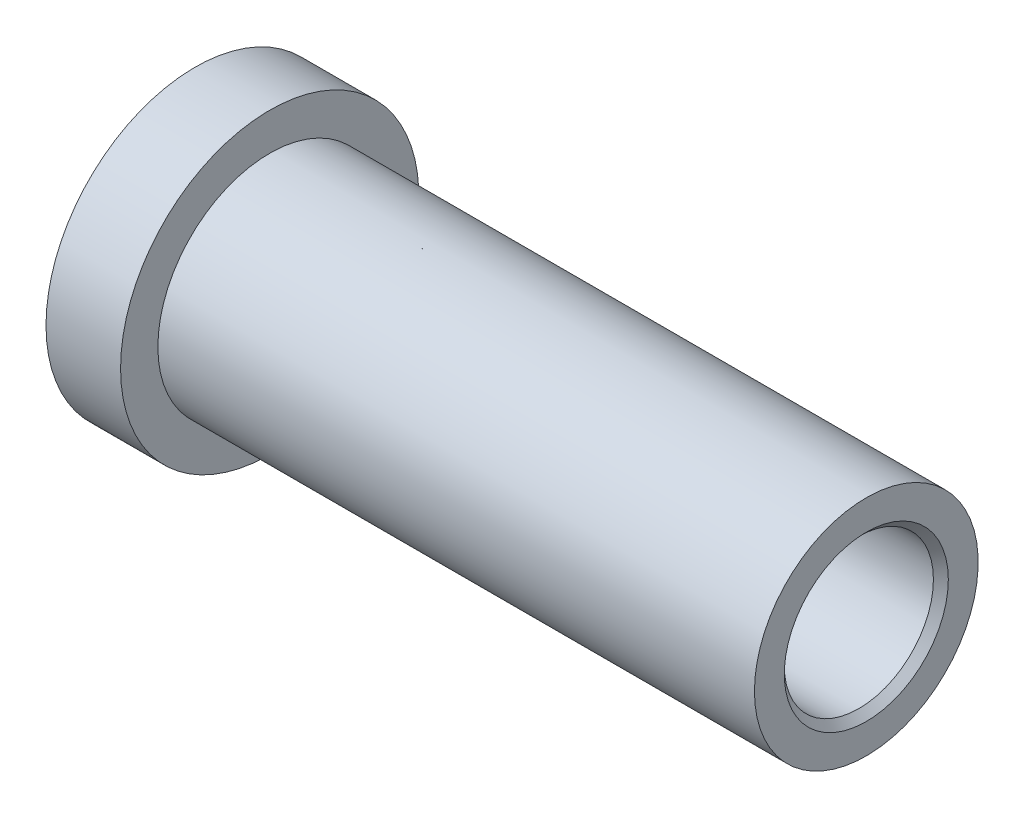
ISO-10303-21;
HEADER;
FILE_DESCRIPTION(('STEP AP214'),'2;1');
FILE_NAME('part.step','',(''),(''),'','','');
FILE_SCHEMA(('AUTOMOTIVE_DESIGN { 1 0 10303 214 1 1 1 1 }'));
ENDSEC;
DATA;
#1=APPLICATION_CONTEXT('core data for automotive mechanical design processes');
#2=APPLICATION_PROTOCOL_DEFINITION('international standard','automotive_design',2000,#1);
#3=PRODUCT_CONTEXT('',#1,'mechanical');
#4=PRODUCT('Part','Part','',(#3));
#5=PRODUCT_RELATED_PRODUCT_CATEGORY('part','',(#4));
#6=PRODUCT_DEFINITION_FORMATION('','',#4);
#7=PRODUCT_DEFINITION_CONTEXT('part definition',#1,'design');
#8=PRODUCT_DEFINITION('design','',#6,#7);
#9=PRODUCT_DEFINITION_SHAPE('','',#8);
#10=(LENGTH_UNIT() NAMED_UNIT(*) SI_UNIT(.MILLI.,.METRE.));
#11=(NAMED_UNIT(*) PLANE_ANGLE_UNIT() SI_UNIT($,.RADIAN.));
#12=(NAMED_UNIT(*) SI_UNIT($,.STERADIAN.) SOLID_ANGLE_UNIT());
#13=UNCERTAINTY_MEASURE_WITH_UNIT(LENGTH_MEASURE(1.E-05),#10,'distance_accuracy_value','');
#14=(GEOMETRIC_REPRESENTATION_CONTEXT(3) GLOBAL_UNCERTAINTY_ASSIGNED_CONTEXT((#13)) GLOBAL_UNIT_ASSIGNED_CONTEXT((#10,
#11,#12)) REPRESENTATION_CONTEXT('',''));
#15=CARTESIAN_POINT('',(0.,0.,0.));
#16=DIRECTION('',(0.,0.,1.));
#17=DIRECTION('',(1.,0.,0.));
#18=AXIS2_PLACEMENT_3D('',#15,#16,#17);
#19=CARTESIAN_POINT('',(0.,0.,0.));
#20=DIRECTION('',(-1.,0.,0.));
#21=DIRECTION('',(0.,0.,1.));
#22=AXIS2_PLACEMENT_3D('',#19,#20,#21);
#23=PLANE('',#22);
#24=CARTESIAN_POINT('',(0.,0.,0.));
#25=DIRECTION('',(-1.,0.,0.));
#26=DIRECTION('',(0.,0.,1.));
#27=AXIS2_PLACEMENT_3D('',#24,#25,#26);
#28=CIRCLE('',#27,5.50000000000001);
#29=CARTESIAN_POINT('',(0.,0.,5.50000000000001));
#30=VERTEX_POINT('',#29);
#31=EDGE_CURVE('E10',#30,#30,#28,.F.);
#32=ORIENTED_EDGE('',*,*,#31,.T.);
#33=EDGE_LOOP('',(#32));
#34=FACE_BOUND('',#33,.T.);
#35=CARTESIAN_POINT('',(0.,0.,0.));
#36=DIRECTION('',(-1.,0.,0.));
#37=DIRECTION('',(0.,0.,1.));
#38=AXIS2_PLACEMENT_3D('',#35,#36,#37);
#39=CIRCLE('',#38,10.);
#40=CARTESIAN_POINT('',(0.,0.,10.));
#41=VERTEX_POINT('',#40);
#42=EDGE_CURVE('E69',#41,#41,#39,.T.);
#43=ORIENTED_EDGE('',*,*,#42,.T.);
#44=EDGE_LOOP('',(#43));
#45=FACE_BOUND('',#44,.T.);
#46=ADVANCED_FACE('F39',(#34,#45),#23,.T.);
#47=CARTESIAN_POINT('',(0.,0.,0.));
#48=DIRECTION('',(-1.,0.,0.));
#49=DIRECTION('',(0.,0.,1.));
#50=AXIS2_PLACEMENT_3D('',#47,#48,#49);
#51=CYLINDRICAL_SURFACE('',#50,5.);
#52=CARTESIAN_POINT('',(44.5,0.,0.));
#53=DIRECTION('',(1.,0.,0.));
#54=DIRECTION('',(0.,0.,-1.));
#55=AXIS2_PLACEMENT_3D('',#52,#53,#54);
#56=CIRCLE('',#55,5.);
#57=CARTESIAN_POINT('',(44.5,0.,-5.));
#58=VERTEX_POINT('',#57);
#59=EDGE_CURVE('E47',#58,#58,#56,.T.);
#60=ORIENTED_EDGE('',*,*,#59,.T.);
#61=EDGE_LOOP('',(#60));
#62=FACE_BOUND('',#61,.T.);
#63=CARTESIAN_POINT('',(0.500000000000006,0.,0.));
#64=DIRECTION('',(-1.,0.,0.));
#65=DIRECTION('',(0.,0.,1.));
#66=AXIS2_PLACEMENT_3D('',#63,#64,#65);
#67=CIRCLE('',#66,5.);
#68=CARTESIAN_POINT('',(0.500000000000006,0.,5.));
#69=VERTEX_POINT('',#68);
#70=EDGE_CURVE('E51',#69,#69,#67,.T.);
#71=ORIENTED_EDGE('',*,*,#70,.T.);
#72=EDGE_LOOP('',(#71));
#73=FACE_BOUND('',#72,.T.);
#74=ADVANCED_FACE('F89',(#62,#73),#51,.F.);
#75=CARTESIAN_POINT('',(45.,0.,0.));
#76=DIRECTION('',(1.,0.,0.));
#77=DIRECTION('',(0.,0.,-1.));
#78=AXIS2_PLACEMENT_3D('',#75,#76,#77);
#79=PLANE('',#78);
#80=CARTESIAN_POINT('',(45.,0.,0.));
#81=DIRECTION('',(1.,0.,0.));
#82=DIRECTION('',(0.,0.,-1.));
#83=AXIS2_PLACEMENT_3D('',#80,#81,#82);
#84=CIRCLE('',#83,5.5);
#85=CARTESIAN_POINT('',(45.,0.,-5.5));
#86=VERTEX_POINT('',#85);
#87=EDGE_CURVE('E55',#86,#86,#84,.F.);
#88=ORIENTED_EDGE('',*,*,#87,.T.);
#89=EDGE_LOOP('',(#88));
#90=FACE_BOUND('',#89,.T.);
#91=CARTESIAN_POINT('',(45.,0.,0.));
#92=DIRECTION('',(-1.,0.,0.));
#93=DIRECTION('',(0.,0.,1.));
#94=AXIS2_PLACEMENT_3D('',#91,#92,#93);
#95=CIRCLE('',#94,7.5);
#96=CARTESIAN_POINT('',(45.,0.,7.5));
#97=VERTEX_POINT('',#96);
#98=EDGE_CURVE('E60',#97,#97,#95,.T.);
#99=ORIENTED_EDGE('',*,*,#98,.F.);
#100=EDGE_LOOP('',(#99));
#101=FACE_BOUND('',#100,.T.);
#102=ADVANCED_FACE('F94',(#90,#101),#79,.T.);
#103=CARTESIAN_POINT('',(0.,0.,0.));
#104=DIRECTION('',(-1.,0.,0.));
#105=DIRECTION('',(0.,0.,1.));
#106=AXIS2_PLACEMENT_3D('',#103,#104,#105);
#107=CYLINDRICAL_SURFACE('',#106,7.5);
#108=ORIENTED_EDGE('',*,*,#98,.T.);
#109=EDGE_LOOP('',(#108));
#110=FACE_BOUND('',#109,.T.);
#111=CARTESIAN_POINT('',(5.,0.,0.));
#112=DIRECTION('',(-1.,0.,0.));
#113=DIRECTION('',(0.,0.,1.));
#114=AXIS2_PLACEMENT_3D('',#111,#112,#113);
#115=CIRCLE('',#114,7.5);
#116=CARTESIAN_POINT('',(5.,0.,7.5));
#117=VERTEX_POINT('',#116);
#118=EDGE_CURVE('E63',#117,#117,#115,.T.);
#119=ORIENTED_EDGE('',*,*,#118,.F.);
#120=EDGE_LOOP('',(#119));
#121=FACE_BOUND('',#120,.T.);
#122=ADVANCED_FACE('F85',(#110,#121),#107,.T.);
#123=CARTESIAN_POINT('',(5.,0.,0.));
#124=DIRECTION('',(1.,0.,0.));
#125=DIRECTION('',(0.,0.,-1.));
#126=AXIS2_PLACEMENT_3D('',#123,#124,#125);
#127=PLANE('',#126);
#128=ORIENTED_EDGE('',*,*,#118,.T.);
#129=EDGE_LOOP('',(#128));
#130=FACE_BOUND('',#129,.T.);
#131=CARTESIAN_POINT('',(5.,0.,0.));
#132=DIRECTION('',(-1.,0.,0.));
#133=DIRECTION('',(0.,0.,1.));
#134=AXIS2_PLACEMENT_3D('',#131,#132,#133);
#135=CIRCLE('',#134,10.);
#136=CARTESIAN_POINT('',(5.,0.,10.));
#137=VERTEX_POINT('',#136);
#138=EDGE_CURVE('E66',#137,#137,#135,.T.);
#139=ORIENTED_EDGE('',*,*,#138,.F.);
#140=EDGE_LOOP('',(#139));
#141=FACE_BOUND('',#140,.T.);
#142=ADVANCED_FACE('F77',(#130,#141),#127,.T.);
#143=CARTESIAN_POINT('',(0.,0.,0.));
#144=DIRECTION('',(-1.,0.,0.));
#145=DIRECTION('',(0.,0.,1.));
#146=AXIS2_PLACEMENT_3D('',#143,#144,#145);
#147=CYLINDRICAL_SURFACE('',#146,10.);
#148=ORIENTED_EDGE('',*,*,#138,.T.);
#149=EDGE_LOOP('',(#148));
#150=FACE_BOUND('',#149,.T.);
#151=ORIENTED_EDGE('',*,*,#42,.F.);
#152=EDGE_LOOP('',(#151));
#153=FACE_BOUND('',#152,.T.);
#154=ADVANCED_FACE('F74',(#150,#153),#147,.T.);
#155=CARTESIAN_POINT('',(45.,0.,0.));
#156=DIRECTION('',(1.,0.,0.));
#157=DIRECTION('',(0.,0.,-1.));
#158=AXIS2_PLACEMENT_3D('',#155,#156,#157);
#159=CONICAL_SURFACE('',#158,5.5,0.785398163397443);
#160=ORIENTED_EDGE('',*,*,#59,.F.);
#161=EDGE_LOOP('',(#160));
#162=FACE_BOUND('',#161,.T.);
#163=ORIENTED_EDGE('',*,*,#87,.F.);
#164=EDGE_LOOP('',(#163));
#165=FACE_BOUND('',#164,.T.);
#166=ADVANCED_FACE('F76',(#162,#165),#159,.F.);
#167=CARTESIAN_POINT('',(0.500000000000006,0.,0.));
#168=DIRECTION('',(-1.,0.,0.));
#169=DIRECTION('',(0.,0.,1.));
#170=AXIS2_PLACEMENT_3D('',#167,#168,#169);
#171=CONICAL_SURFACE('',#170,5.,0.785398163397452);
#172=ORIENTED_EDGE('',*,*,#31,.F.);
#173=EDGE_LOOP('',(#172));
#174=FACE_BOUND('',#173,.T.);
#175=ORIENTED_EDGE('',*,*,#70,.F.);
#176=EDGE_LOOP('',(#175));
#177=FACE_BOUND('',#176,.T.);
#178=ADVANCED_FACE('F42',(#174,#177),#171,.F.);
#179=CLOSED_SHELL('',(#46,#74,#102,#122,#142,#154,#166,#178));
#180=MANIFOLD_SOLID_BREP('B2',#179);
#181=ADVANCED_BREP_SHAPE_REPRESENTATION('',(#18,#180),#14);
#182=SHAPE_DEFINITION_REPRESENTATION(#9,#181);
ENDSEC;
END-ISO-10303-21;
